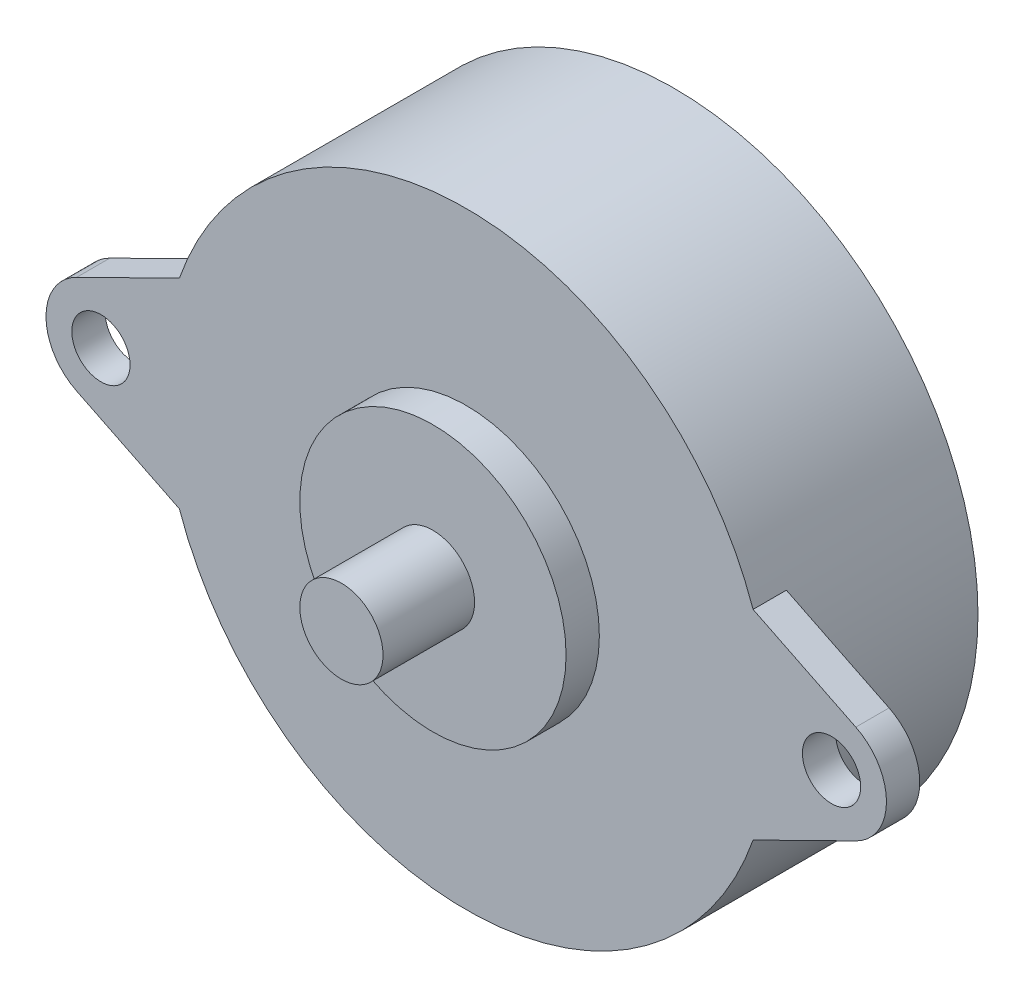
ISO-10303-21;
HEADER;
FILE_DESCRIPTION(('STEP AP214'),'2;1');
FILE_NAME('part.step','',(''),(''),'','','');
FILE_SCHEMA(('AUTOMOTIVE_DESIGN { 1 0 10303 214 1 1 1 1 }'));
ENDSEC;
DATA;
#1=APPLICATION_CONTEXT('core data for automotive mechanical design processes');
#2=APPLICATION_PROTOCOL_DEFINITION('international standard','automotive_design',2000,#1);
#3=PRODUCT_CONTEXT('',#1,'mechanical');
#4=PRODUCT('Part','Part','',(#3));
#5=PRODUCT_RELATED_PRODUCT_CATEGORY('part','',(#4));
#6=PRODUCT_DEFINITION_FORMATION('','',#4);
#7=PRODUCT_DEFINITION_CONTEXT('part definition',#1,'design');
#8=PRODUCT_DEFINITION('design','',#6,#7);
#9=PRODUCT_DEFINITION_SHAPE('','',#8);
#10=(LENGTH_UNIT() NAMED_UNIT(*) SI_UNIT(.MILLI.,.METRE.));
#11=(NAMED_UNIT(*) PLANE_ANGLE_UNIT() SI_UNIT($,.RADIAN.));
#12=(NAMED_UNIT(*) SI_UNIT($,.STERADIAN.) SOLID_ANGLE_UNIT());
#13=UNCERTAINTY_MEASURE_WITH_UNIT(LENGTH_MEASURE(1.E-05),#10,'distance_accuracy_value','');
#14=(GEOMETRIC_REPRESENTATION_CONTEXT(3) GLOBAL_UNCERTAINTY_ASSIGNED_CONTEXT((#13)) GLOBAL_UNIT_ASSIGNED_CONTEXT((#10,
#11,#12)) REPRESENTATION_CONTEXT('',''));
#15=CARTESIAN_POINT('',(0.,0.,0.));
#16=DIRECTION('',(0.,0.,1.));
#17=DIRECTION('',(1.,0.,0.));
#18=AXIS2_PLACEMENT_3D('',#15,#16,#17);
#19=CARTESIAN_POINT('',(0.,0.,12.5));
#20=DIRECTION('',(0.,0.,-1.));
#21=DIRECTION('',(-1.,0.,0.));
#22=AXIS2_PLACEMENT_3D('',#19,#20,#21);
#23=CYLINDRICAL_SURFACE('',#22,18.25);
#24=CARTESIAN_POINT('',(0.,0.,10.5));
#25=DIRECTION('',(0.,0.,-1.));
#26=DIRECTION('',(-1.,0.,0.));
#27=AXIS2_PLACEMENT_3D('',#24,#25,#26);
#28=CIRCLE('',#27,18.25);
#29=CARTESIAN_POINT('',(17.2355011531432,6.,10.5));
#30=VERTEX_POINT('',#29);
#31=CARTESIAN_POINT('',(17.2355011531432,-6.,10.5));
#32=VERTEX_POINT('',#31);
#33=EDGE_CURVE('E118',#30,#32,#28,.T.);
#34=ORIENTED_EDGE('',*,*,#33,.T.);
#35=DIRECTION('',(0.,0.,1.));
#36=VECTOR('',#35,1.);
#37=CARTESIAN_POINT('',(17.2355011531432,-6.,10.5));
#38=LINE('',#37,#36);
#39=CARTESIAN_POINT('',(17.2355011531432,-6.,12.5));
#40=VERTEX_POINT('',#39);
#41=EDGE_CURVE('E138',#32,#40,#38,.T.);
#42=ORIENTED_EDGE('',*,*,#41,.T.);
#43=CARTESIAN_POINT('',(0.,0.,12.5));
#44=DIRECTION('',(0.,0.,1.));
#45=DIRECTION('',(1.,0.,0.));
#46=AXIS2_PLACEMENT_3D('',#43,#44,#45);
#47=CIRCLE('',#46,18.25);
#48=CARTESIAN_POINT('',(-17.2355011531432,-6.,12.5));
#49=VERTEX_POINT('',#48);
#50=EDGE_CURVE('E173',#49,#40,#47,.T.);
#51=ORIENTED_EDGE('',*,*,#50,.F.);
#52=DIRECTION('',(0.,0.,1.));
#53=VECTOR('',#52,1.);
#54=CARTESIAN_POINT('',(-17.2355011531432,-6.,10.5));
#55=LINE('',#54,#53);
#56=CARTESIAN_POINT('',(-17.2355011531432,-6.,10.5));
#57=VERTEX_POINT('',#56);
#58=EDGE_CURVE('E171',#57,#49,#55,.T.);
#59=ORIENTED_EDGE('',*,*,#58,.F.);
#60=CARTESIAN_POINT('',(0.,0.,10.5));
#61=DIRECTION('',(0.,0.,-1.));
#62=DIRECTION('',(1.,0.,0.));
#63=AXIS2_PLACEMENT_3D('',#60,#61,#62);
#64=CIRCLE('',#63,18.25);
#65=CARTESIAN_POINT('',(-17.2355011531432,6.,10.5));
#66=VERTEX_POINT('',#65);
#67=EDGE_CURVE('E155',#57,#66,#64,.T.);
#68=ORIENTED_EDGE('',*,*,#67,.T.);
#69=DIRECTION('',(0.,0.,1.));
#70=VECTOR('',#69,1.);
#71=CARTESIAN_POINT('',(-17.2355011531432,6.,10.5));
#72=LINE('',#71,#70);
#73=CARTESIAN_POINT('',(-17.2355011531432,6.,12.5));
#74=VERTEX_POINT('',#73);
#75=EDGE_CURVE('E168',#66,#74,#72,.T.);
#76=ORIENTED_EDGE('',*,*,#75,.T.);
#77=CARTESIAN_POINT('',(17.2355011531432,6.,12.5));
#78=VERTEX_POINT('',#77);
#79=EDGE_CURVE('E174',#78,#74,#47,.T.);
#80=ORIENTED_EDGE('',*,*,#79,.F.);
#81=DIRECTION('',(0.,0.,1.));
#82=VECTOR('',#81,1.);
#83=CARTESIAN_POINT('',(17.2355011531432,6.,10.5));
#84=LINE('',#83,#82);
#85=EDGE_CURVE('E108',#30,#78,#84,.T.);
#86=ORIENTED_EDGE('',*,*,#85,.F.);
#87=EDGE_LOOP('',(#34,#42,#51,#59,#68,#76,#80,#86));
#88=FACE_BOUND('',#87,.T.);
#89=CARTESIAN_POINT('',(0.,0.,0.));
#90=DIRECTION('',(0.,0.,1.));
#91=DIRECTION('',(1.,0.,0.));
#92=AXIS2_PLACEMENT_3D('',#89,#90,#91);
#93=CIRCLE('',#92,18.25);
#94=CARTESIAN_POINT('',(18.25,0.,0.));
#95=VERTEX_POINT('',#94);
#96=EDGE_CURVE('E36',#95,#95,#93,.T.);
#97=ORIENTED_EDGE('',*,*,#96,.T.);
#98=EDGE_LOOP('',(#97));
#99=FACE_BOUND('',#98,.T.);
#100=ADVANCED_FACE('F33',(#88,#99),#23,.T.);
#101=CARTESIAN_POINT('',(0.,0.,12.5));
#102=DIRECTION('',(0.,0.,1.));
#103=DIRECTION('',(1.,0.,0.));
#104=AXIS2_PLACEMENT_3D('',#101,#102,#103);
#105=PLANE('',#104);
#106=CARTESIAN_POINT('',(0.,0.,12.5));
#107=DIRECTION('',(0.,0.,1.));
#108=DIRECTION('',(1.,0.,0.));
#109=AXIS2_PLACEMENT_3D('',#106,#107,#108);
#110=CIRCLE('',#109,8.);
#111=CARTESIAN_POINT('',(8.,0.,12.5));
#112=VERTEX_POINT('',#111);
#113=EDGE_CURVE('E41',#112,#112,#110,.T.);
#114=ORIENTED_EDGE('',*,*,#113,.F.);
#115=EDGE_LOOP('',(#114));
#116=FACE_BOUND('',#115,.T.);
#117=ORIENTED_EDGE('',*,*,#50,.T.);
#118=DIRECTION('',(0.89712539673719,0.441775986818137,0.));
#119=VECTOR('',#118,1.);
#120=CARTESIAN_POINT('',(23.4078607564999,-2.96051380923273,12.5));
#121=LINE('',#120,#119);
#122=CARTESIAN_POINT('',(23.4078607564999,-2.96051380923273,12.5));
#123=VERTEX_POINT('',#122);
#124=EDGE_CURVE('E122',#40,#123,#121,.T.);
#125=ORIENTED_EDGE('',*,*,#124,.T.);
#126=CARTESIAN_POINT('',(21.95,0.,12.5));
#127=DIRECTION('',(0.,0.,1.));
#128=DIRECTION('',(-1.,0.,0.));
#129=AXIS2_PLACEMENT_3D('',#126,#127,#128);
#130=CIRCLE('',#129,3.3);
#131=CARTESIAN_POINT('',(23.4078607564999,2.96051380923273,12.5));
#132=VERTEX_POINT('',#131);
#133=EDGE_CURVE('E132',#123,#132,#130,.T.);
#134=ORIENTED_EDGE('',*,*,#133,.T.);
#135=DIRECTION('',(-0.89712539673719,0.441775986818137,0.));
#136=VECTOR('',#135,1.);
#137=CARTESIAN_POINT('',(23.4078607564999,2.96051380923273,12.5));
#138=LINE('',#137,#136);
#139=EDGE_CURVE('E49',#132,#78,#138,.T.);
#140=ORIENTED_EDGE('',*,*,#139,.T.);
#141=ORIENTED_EDGE('',*,*,#79,.T.);
#142=DIRECTION('',(-0.89712539673719,-0.441775986818137,0.));
#143=VECTOR('',#142,1.);
#144=CARTESIAN_POINT('',(-23.4078607564999,2.96051380923273,12.5));
#145=LINE('',#144,#143);
#146=CARTESIAN_POINT('',(-23.4078607564999,2.96051380923273,12.5));
#147=VERTEX_POINT('',#146);
#148=EDGE_CURVE('E152',#74,#147,#145,.T.);
#149=ORIENTED_EDGE('',*,*,#148,.T.);
#150=CARTESIAN_POINT('',(-21.95,0.,12.5));
#151=DIRECTION('',(0.,0.,1.));
#152=DIRECTION('',(1.,0.,0.));
#153=AXIS2_PLACEMENT_3D('',#150,#151,#152);
#154=CIRCLE('',#153,3.3);
#155=CARTESIAN_POINT('',(-23.4078607564999,-2.96051380923273,12.5));
#156=VERTEX_POINT('',#155);
#157=EDGE_CURVE('E145',#147,#156,#154,.T.);
#158=ORIENTED_EDGE('',*,*,#157,.T.);
#159=DIRECTION('',(0.89712539673719,-0.441775986818137,0.));
#160=VECTOR('',#159,1.);
#161=CARTESIAN_POINT('',(-23.4078607564999,-2.96051380923273,12.5));
#162=LINE('',#161,#160);
#163=EDGE_CURVE('E56',#156,#49,#162,.T.);
#164=ORIENTED_EDGE('',*,*,#163,.T.);
#165=EDGE_LOOP('',(#117,#125,#134,#140,#141,#149,#158,#164));
#166=FACE_BOUND('',#165,.T.);
#167=CARTESIAN_POINT('',(-21.95,0.,12.5));
#168=DIRECTION('',(0.,0.,1.));
#169=DIRECTION('',(1.,0.,0.));
#170=AXIS2_PLACEMENT_3D('',#167,#168,#169);
#171=CIRCLE('',#170,1.75);
#172=CARTESIAN_POINT('',(-20.2,0.,12.5));
#173=VERTEX_POINT('',#172);
#174=EDGE_CURVE('E137',#173,#173,#171,.T.);
#175=ORIENTED_EDGE('',*,*,#174,.F.);
#176=EDGE_LOOP('',(#175));
#177=FACE_BOUND('',#176,.T.);
#178=CARTESIAN_POINT('',(21.95,0.,12.5));
#179=DIRECTION('',(0.,0.,1.));
#180=DIRECTION('',(1.,0.,0.));
#181=AXIS2_PLACEMENT_3D('',#178,#179,#180);
#182=CIRCLE('',#181,1.75);
#183=CARTESIAN_POINT('',(23.7,0.,12.5));
#184=VERTEX_POINT('',#183);
#185=EDGE_CURVE('E127',#184,#184,#182,.T.);
#186=ORIENTED_EDGE('',*,*,#185,.F.);
#187=EDGE_LOOP('',(#186));
#188=FACE_BOUND('',#187,.T.);
#189=ADVANCED_FACE('F187',(#116,#166,#177,#188),#105,.T.);
#190=CARTESIAN_POINT('',(0.,0.,0.));
#191=DIRECTION('',(0.,0.,1.));
#192=DIRECTION('',(1.,0.,0.));
#193=AXIS2_PLACEMENT_3D('',#190,#191,#192);
#194=PLANE('',#193);
#195=ORIENTED_EDGE('',*,*,#96,.F.);
#196=EDGE_LOOP('',(#195));
#197=FACE_BOUND('',#196,.T.);
#198=ADVANCED_FACE('F184',(#197),#194,.F.);
#199=CARTESIAN_POINT('',(-21.95,0.,10.5));
#200=DIRECTION('',(0.,0.,1.));
#201=DIRECTION('',(1.,0.,0.));
#202=AXIS2_PLACEMENT_3D('',#199,#200,#201);
#203=CYLINDRICAL_SURFACE('',#202,3.3);
#204=ORIENTED_EDGE('',*,*,#157,.F.);
#205=DIRECTION('',(0.,0.,1.));
#206=VECTOR('',#205,1.);
#207=CARTESIAN_POINT('',(-23.4078607564999,2.96051380923273,10.5));
#208=LINE('',#207,#206);
#209=CARTESIAN_POINT('',(-23.4078607564999,2.96051380923273,10.5));
#210=VERTEX_POINT('',#209);
#211=EDGE_CURVE('E166',#210,#147,#208,.T.);
#212=ORIENTED_EDGE('',*,*,#211,.F.);
#213=CARTESIAN_POINT('',(-21.95,0.,10.5));
#214=DIRECTION('',(0.,0.,1.));
#215=DIRECTION('',(1.,0.,0.));
#216=AXIS2_PLACEMENT_3D('',#213,#214,#215);
#217=CIRCLE('',#216,3.3);
#218=CARTESIAN_POINT('',(-23.4078607564999,-2.96051380923273,10.5));
#219=VERTEX_POINT('',#218);
#220=EDGE_CURVE('E148',#210,#219,#217,.T.);
#221=ORIENTED_EDGE('',*,*,#220,.T.);
#222=DIRECTION('',(0.,0.,1.));
#223=VECTOR('',#222,1.);
#224=CARTESIAN_POINT('',(-23.4078607564999,-2.96051380923273,10.5));
#225=LINE('',#224,#223);
#226=EDGE_CURVE('E161',#219,#156,#225,.T.);
#227=ORIENTED_EDGE('',*,*,#226,.T.);
#228=EDGE_LOOP('',(#204,#212,#221,#227));
#229=FACE_BOUND('',#228,.T.);
#230=ADVANCED_FACE('F186',(#229),#203,.T.);
#231=CARTESIAN_POINT('',(-23.4078607564999,2.96051380923273,10.5));
#232=DIRECTION('',(-0.441775986818137,0.89712539673719,0.));
#233=DIRECTION('',(-0.89712539673719,-0.441775986818137,0.));
#234=AXIS2_PLACEMENT_3D('',#231,#232,#233);
#235=PLANE('',#234);
#236=ORIENTED_EDGE('',*,*,#148,.F.);
#237=ORIENTED_EDGE('',*,*,#75,.F.);
#238=DIRECTION('',(-0.89712539673719,-0.441775986818137,0.));
#239=VECTOR('',#238,1.);
#240=CARTESIAN_POINT('',(-23.4078607564999,2.96051380923273,10.5));
#241=LINE('',#240,#239);
#242=EDGE_CURVE('E158',#66,#210,#241,.T.);
#243=ORIENTED_EDGE('',*,*,#242,.T.);
#244=ORIENTED_EDGE('',*,*,#211,.T.);
#245=EDGE_LOOP('',(#236,#237,#243,#244));
#246=FACE_BOUND('',#245,.T.);
#247=ADVANCED_FACE('F192',(#246),#235,.T.);
#248=CARTESIAN_POINT('',(-23.4078607564999,-2.96051380923273,10.5));
#249=DIRECTION('',(-0.441775986818137,-0.89712539673719,0.));
#250=DIRECTION('',(0.89712539673719,-0.441775986818137,0.));
#251=AXIS2_PLACEMENT_3D('',#248,#249,#250);
#252=PLANE('',#251);
#253=ORIENTED_EDGE('',*,*,#163,.F.);
#254=ORIENTED_EDGE('',*,*,#226,.F.);
#255=DIRECTION('',(0.89712539673719,-0.441775986818137,0.));
#256=VECTOR('',#255,1.);
#257=CARTESIAN_POINT('',(-23.4078607564999,-2.96051380923273,10.5));
#258=LINE('',#257,#256);
#259=EDGE_CURVE('E151',#219,#57,#258,.T.);
#260=ORIENTED_EDGE('',*,*,#259,.T.);
#261=ORIENTED_EDGE('',*,*,#58,.T.);
#262=EDGE_LOOP('',(#253,#254,#260,#261));
#263=FACE_BOUND('',#262,.T.);
#264=ADVANCED_FACE('F266',(#263),#252,.T.);
#265=CARTESIAN_POINT('',(-21.95,0.,10.5));
#266=DIRECTION('',(0.,0.,1.));
#267=DIRECTION('',(1.,0.,0.));
#268=AXIS2_PLACEMENT_3D('',#265,#266,#267);
#269=PLANE('',#268);
#270=CARTESIAN_POINT('',(-21.95,0.,10.5));
#271=DIRECTION('',(0.,0.,1.));
#272=DIRECTION('',(1.,0.,0.));
#273=AXIS2_PLACEMENT_3D('',#270,#271,#272);
#274=CIRCLE('',#273,1.75);
#275=CARTESIAN_POINT('',(-20.2,0.,10.5));
#276=VERTEX_POINT('',#275);
#277=EDGE_CURVE('E142',#276,#276,#274,.T.);
#278=ORIENTED_EDGE('',*,*,#277,.T.);
#279=EDGE_LOOP('',(#278));
#280=FACE_BOUND('',#279,.T.);
#281=ORIENTED_EDGE('',*,*,#220,.F.);
#282=ORIENTED_EDGE('',*,*,#242,.F.);
#283=ORIENTED_EDGE('',*,*,#67,.F.);
#284=ORIENTED_EDGE('',*,*,#259,.F.);
#285=EDGE_LOOP('',(#281,#282,#283,#284));
#286=FACE_BOUND('',#285,.T.);
#287=ADVANCED_FACE('F206',(#280,#286),#269,.F.);
#288=CARTESIAN_POINT('',(-21.95,0.,10.5));
#289=DIRECTION('',(0.,0.,1.));
#290=DIRECTION('',(1.,0.,0.));
#291=AXIS2_PLACEMENT_3D('',#288,#289,#290);
#292=CYLINDRICAL_SURFACE('',#291,1.75);
#293=ORIENTED_EDGE('',*,*,#277,.F.);
#294=EDGE_LOOP('',(#293));
#295=FACE_BOUND('',#294,.T.);
#296=ORIENTED_EDGE('',*,*,#174,.T.);
#297=EDGE_LOOP('',(#296));
#298=FACE_BOUND('',#297,.T.);
#299=ADVANCED_FACE('F260',(#295,#298),#292,.F.);
#300=CARTESIAN_POINT('',(21.95,0.,10.5));
#301=DIRECTION('',(0.,0.,1.));
#302=DIRECTION('',(1.,0.,0.));
#303=AXIS2_PLACEMENT_3D('',#300,#301,#302);
#304=CYLINDRICAL_SURFACE('',#303,3.3);
#305=ORIENTED_EDGE('',*,*,#133,.F.);
#306=DIRECTION('',(0.,0.,1.));
#307=VECTOR('',#306,1.);
#308=CARTESIAN_POINT('',(23.4078607564999,-2.96051380923273,10.5));
#309=LINE('',#308,#307);
#310=CARTESIAN_POINT('',(23.4078607564999,-2.96051380923273,10.5));
#311=VERTEX_POINT('',#310);
#312=EDGE_CURVE('E121',#311,#123,#309,.T.);
#313=ORIENTED_EDGE('',*,*,#312,.F.);
#314=CARTESIAN_POINT('',(21.95,0.,10.5));
#315=DIRECTION('',(0.,0.,1.));
#316=DIRECTION('',(-1.,0.,0.));
#317=AXIS2_PLACEMENT_3D('',#314,#315,#316);
#318=CIRCLE('',#317,3.3);
#319=CARTESIAN_POINT('',(23.4078607564999,2.96051380923273,10.5));
#320=VERTEX_POINT('',#319);
#321=EDGE_CURVE('E115',#311,#320,#318,.T.);
#322=ORIENTED_EDGE('',*,*,#321,.T.);
#323=DIRECTION('',(0.,0.,1.));
#324=VECTOR('',#323,1.);
#325=CARTESIAN_POINT('',(23.4078607564999,2.96051380923273,10.5));
#326=LINE('',#325,#324);
#327=EDGE_CURVE('E100',#320,#132,#326,.T.);
#328=ORIENTED_EDGE('',*,*,#327,.T.);
#329=EDGE_LOOP('',(#305,#313,#322,#328));
#330=FACE_BOUND('',#329,.T.);
#331=ADVANCED_FACE('F120',(#330),#304,.T.);
#332=CARTESIAN_POINT('',(23.4078607564999,-2.96051380923273,10.5));
#333=DIRECTION('',(0.441775986818137,-0.89712539673719,0.));
#334=DIRECTION('',(0.89712539673719,0.441775986818137,0.));
#335=AXIS2_PLACEMENT_3D('',#332,#333,#334);
#336=PLANE('',#335);
#337=ORIENTED_EDGE('',*,*,#124,.F.);
#338=ORIENTED_EDGE('',*,*,#41,.F.);
#339=DIRECTION('',(0.89712539673719,0.441775986818137,0.));
#340=VECTOR('',#339,1.);
#341=CARTESIAN_POINT('',(23.4078607564999,-2.96051380923273,10.5));
#342=LINE('',#341,#340);
#343=EDGE_CURVE('E109',#32,#311,#342,.T.);
#344=ORIENTED_EDGE('',*,*,#343,.T.);
#345=ORIENTED_EDGE('',*,*,#312,.T.);
#346=EDGE_LOOP('',(#337,#338,#344,#345));
#347=FACE_BOUND('',#346,.T.);
#348=ADVANCED_FACE('F252',(#347),#336,.T.);
#349=CARTESIAN_POINT('',(23.4078607564999,2.96051380923273,10.5));
#350=DIRECTION('',(0.441775986818137,0.89712539673719,0.));
#351=DIRECTION('',(-0.89712539673719,0.441775986818137,0.));
#352=AXIS2_PLACEMENT_3D('',#349,#350,#351);
#353=PLANE('',#352);
#354=ORIENTED_EDGE('',*,*,#139,.F.);
#355=ORIENTED_EDGE('',*,*,#327,.F.);
#356=DIRECTION('',(-0.89712539673719,0.441775986818137,0.));
#357=VECTOR('',#356,1.);
#358=CARTESIAN_POINT('',(23.4078607564999,2.96051380923273,10.5));
#359=LINE('',#358,#357);
#360=EDGE_CURVE('E103',#320,#30,#359,.T.);
#361=ORIENTED_EDGE('',*,*,#360,.T.);
#362=ORIENTED_EDGE('',*,*,#85,.T.);
#363=EDGE_LOOP('',(#354,#355,#361,#362));
#364=FACE_BOUND('',#363,.T.);
#365=ADVANCED_FACE('F102',(#364),#353,.T.);
#366=CARTESIAN_POINT('',(21.95,0.,10.5));
#367=DIRECTION('',(0.,0.,-1.));
#368=DIRECTION('',(-1.,0.,0.));
#369=AXIS2_PLACEMENT_3D('',#366,#367,#368);
#370=PLANE('',#369);
#371=CARTESIAN_POINT('',(21.95,0.,10.5));
#372=DIRECTION('',(0.,0.,1.));
#373=DIRECTION('',(1.,0.,0.));
#374=AXIS2_PLACEMENT_3D('',#371,#372,#373);
#375=CIRCLE('',#374,1.75);
#376=CARTESIAN_POINT('',(23.7,0.,10.5));
#377=VERTEX_POINT('',#376);
#378=EDGE_CURVE('E134',#377,#377,#375,.T.);
#379=ORIENTED_EDGE('',*,*,#378,.T.);
#380=EDGE_LOOP('',(#379));
#381=FACE_BOUND('',#380,.T.);
#382=ORIENTED_EDGE('',*,*,#321,.F.);
#383=ORIENTED_EDGE('',*,*,#343,.F.);
#384=ORIENTED_EDGE('',*,*,#33,.F.);
#385=ORIENTED_EDGE('',*,*,#360,.F.);
#386=EDGE_LOOP('',(#382,#383,#384,#385));
#387=FACE_BOUND('',#386,.T.);
#388=ADVANCED_FACE('F113',(#381,#387),#370,.T.);
#389=CARTESIAN_POINT('',(21.95,0.,10.5));
#390=DIRECTION('',(0.,0.,1.));
#391=DIRECTION('',(1.,0.,0.));
#392=AXIS2_PLACEMENT_3D('',#389,#390,#391);
#393=CYLINDRICAL_SURFACE('',#392,1.75);
#394=ORIENTED_EDGE('',*,*,#378,.F.);
#395=EDGE_LOOP('',(#394));
#396=FACE_BOUND('',#395,.T.);
#397=ORIENTED_EDGE('',*,*,#185,.T.);
#398=EDGE_LOOP('',(#397));
#399=FACE_BOUND('',#398,.T.);
#400=ADVANCED_FACE('F241',(#396,#399),#393,.F.);
#401=CARTESIAN_POINT('',(0.,0.,14.5));
#402=DIRECTION('',(0.,0.,-1.));
#403=DIRECTION('',(-1.,0.,0.));
#404=AXIS2_PLACEMENT_3D('',#401,#402,#403);
#405=CYLINDRICAL_SURFACE('',#404,8.);
#406=CARTESIAN_POINT('',(0.,0.,14.5));
#407=DIRECTION('',(0.,0.,1.));
#408=DIRECTION('',(1.,0.,0.));
#409=AXIS2_PLACEMENT_3D('',#406,#407,#408);
#410=CIRCLE('',#409,8.);
#411=CARTESIAN_POINT('',(8.,0.,14.5));
#412=VERTEX_POINT('',#411);
#413=EDGE_CURVE('E215',#412,#412,#410,.T.);
#414=ORIENTED_EDGE('',*,*,#413,.F.);
#415=EDGE_LOOP('',(#414));
#416=FACE_BOUND('',#415,.T.);
#417=ORIENTED_EDGE('',*,*,#113,.T.);
#418=EDGE_LOOP('',(#417));
#419=FACE_BOUND('',#418,.T.);
#420=ADVANCED_FACE('F236',(#416,#419),#405,.T.);
#421=CARTESIAN_POINT('',(0.,0.,14.5));
#422=DIRECTION('',(0.,0.,1.));
#423=DIRECTION('',(1.,0.,0.));
#424=AXIS2_PLACEMENT_3D('',#421,#422,#423);
#425=PLANE('',#424);
#426=CARTESIAN_POINT('',(0.,0.,14.5));
#427=DIRECTION('',(0.,0.,1.));
#428=DIRECTION('',(1.,0.,0.));
#429=AXIS2_PLACEMENT_3D('',#426,#427,#428);
#430=CIRCLE('',#429,2.5);
#431=CARTESIAN_POINT('',(2.5,0.,14.5));
#432=VERTEX_POINT('',#431);
#433=EDGE_CURVE('E11',#432,#432,#430,.T.);
#434=ORIENTED_EDGE('',*,*,#433,.F.);
#435=EDGE_LOOP('',(#434));
#436=FACE_BOUND('',#435,.T.);
#437=ORIENTED_EDGE('',*,*,#413,.T.);
#438=EDGE_LOOP('',(#437));
#439=FACE_BOUND('',#438,.T.);
#440=ADVANCED_FACE('F231',(#436,#439),#425,.T.);
#441=CARTESIAN_POINT('',(0.,0.,20.));
#442=DIRECTION('',(0.,0.,-1.));
#443=DIRECTION('',(-1.,0.,0.));
#444=AXIS2_PLACEMENT_3D('',#441,#442,#443);
#445=CYLINDRICAL_SURFACE('',#444,2.5);
#446=CARTESIAN_POINT('',(0.,0.,20.));
#447=DIRECTION('',(0.,0.,1.));
#448=DIRECTION('',(1.,0.,0.));
#449=AXIS2_PLACEMENT_3D('',#446,#447,#448);
#450=CIRCLE('',#449,2.5);
#451=CARTESIAN_POINT('',(2.5,0.,20.));
#452=VERTEX_POINT('',#451);
#453=EDGE_CURVE('E218',#452,#452,#450,.T.);
#454=ORIENTED_EDGE('',*,*,#453,.F.);
#455=EDGE_LOOP('',(#454));
#456=FACE_BOUND('',#455,.T.);
#457=ORIENTED_EDGE('',*,*,#433,.T.);
#458=EDGE_LOOP('',(#457));
#459=FACE_BOUND('',#458,.T.);
#460=ADVANCED_FACE('F228',(#456,#459),#445,.T.);
#461=CARTESIAN_POINT('',(0.,0.,20.));
#462=DIRECTION('',(0.,0.,1.));
#463=DIRECTION('',(1.,0.,0.));
#464=AXIS2_PLACEMENT_3D('',#461,#462,#463);
#465=PLANE('',#464);
#466=ORIENTED_EDGE('',*,*,#453,.T.);
#467=EDGE_LOOP('',(#466));
#468=FACE_BOUND('',#467,.T.);
#469=ADVANCED_FACE('F226',(#468),#465,.T.);
#470=CLOSED_SHELL('',(#100,#189,#198,#230,#247,#264,#287,#299,#331,#348,#365,#388,#400,#420,
#440,#460,#469));
#471=MANIFOLD_SOLID_BREP('B2',#470);
#472=ADVANCED_BREP_SHAPE_REPRESENTATION('',(#18,#471),#14);
#473=SHAPE_DEFINITION_REPRESENTATION(#9,#472);
ENDSEC;
END-ISO-10303-21;
